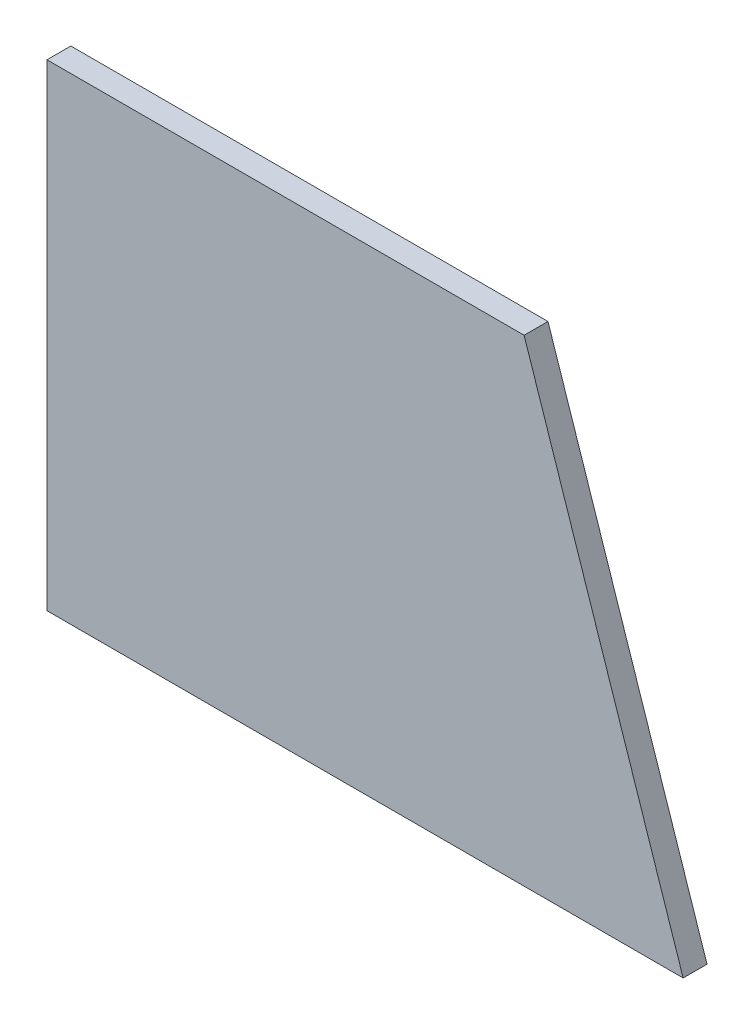
ISO-10303-21;
HEADER;
FILE_DESCRIPTION(('STEP AP214'),'2;1');
FILE_NAME('part.step','',(''),(''),'','','');
FILE_SCHEMA(('AUTOMOTIVE_DESIGN { 1 0 10303 214 1 1 1 1 }'));
ENDSEC;
DATA;
#1=APPLICATION_CONTEXT('core data for automotive mechanical design processes');
#2=APPLICATION_PROTOCOL_DEFINITION('international standard','automotive_design',2000,#1);
#3=PRODUCT_CONTEXT('',#1,'mechanical');
#4=PRODUCT('Part','Part','',(#3));
#5=PRODUCT_RELATED_PRODUCT_CATEGORY('part','',(#4));
#6=PRODUCT_DEFINITION_FORMATION('','',#4);
#7=PRODUCT_DEFINITION_CONTEXT('part definition',#1,'design');
#8=PRODUCT_DEFINITION('design','',#6,#7);
#9=PRODUCT_DEFINITION_SHAPE('','',#8);
#10=(LENGTH_UNIT() NAMED_UNIT(*) SI_UNIT(.MILLI.,.METRE.));
#11=(NAMED_UNIT(*) PLANE_ANGLE_UNIT() SI_UNIT($,.RADIAN.));
#12=(NAMED_UNIT(*) SI_UNIT($,.STERADIAN.) SOLID_ANGLE_UNIT());
#13=UNCERTAINTY_MEASURE_WITH_UNIT(LENGTH_MEASURE(1.E-05),#10,'distance_accuracy_value','');
#14=(GEOMETRIC_REPRESENTATION_CONTEXT(3) GLOBAL_UNCERTAINTY_ASSIGNED_CONTEXT((#13)) GLOBAL_UNIT_ASSIGNED_CONTEXT((#10,
#11,#12)) REPRESENTATION_CONTEXT('',''));
#15=CARTESIAN_POINT('',(0.,0.,0.));
#16=DIRECTION('',(0.,0.,1.));
#17=DIRECTION('',(1.,0.,0.));
#18=AXIS2_PLACEMENT_3D('',#15,#16,#17);
#19=CARTESIAN_POINT('',(0.526438878214051,-0.279919601159078,0.015));
#20=DIRECTION('',(0.,1.,0.));
#21=DIRECTION('',(-1.,0.,0.));
#22=AXIS2_PLACEMENT_3D('',#19,#20,#21);
#23=PLANE('',#22);
#24=DIRECTION('',(1.,0.,0.));
#25=VECTOR('',#24,1.);
#26=CARTESIAN_POINT('',(0.526438878214051,-0.279919601159078,-0.015));
#27=LINE('',#26,#25);
#28=CARTESIAN_POINT('',(-0.273561121785949,-0.279919601159078,-0.015));
#29=VERTEX_POINT('',#28);
#30=CARTESIAN_POINT('',(0.526438878214051,-0.279919601159078,-0.015));
#31=VERTEX_POINT('',#30);
#32=EDGE_CURVE('E95',#29,#31,#27,.T.);
#33=ORIENTED_EDGE('',*,*,#32,.T.);
#34=DIRECTION('',(0.,0.,-1.));
#35=VECTOR('',#34,1.);
#36=CARTESIAN_POINT('',(0.526438878214051,-0.279919601159078,0.015));
#37=LINE('',#36,#35);
#38=CARTESIAN_POINT('',(0.526438878214051,-0.279919601159078,0.015));
#39=VERTEX_POINT('',#38);
#40=EDGE_CURVE('E11',#39,#31,#37,.T.);
#41=ORIENTED_EDGE('',*,*,#40,.F.);
#42=DIRECTION('',(1.,0.,0.));
#43=VECTOR('',#42,1.);
#44=CARTESIAN_POINT('',(0.526438878214051,-0.279919601159078,0.015));
#45=LINE('',#44,#43);
#46=CARTESIAN_POINT('',(-0.273561121785949,-0.279919601159078,0.015));
#47=VERTEX_POINT('',#46);
#48=EDGE_CURVE('E83',#47,#39,#45,.T.);
#49=ORIENTED_EDGE('',*,*,#48,.F.);
#50=DIRECTION('',(0.,0.,-1.));
#51=VECTOR('',#50,1.);
#52=CARTESIAN_POINT('',(-0.273561121785949,-0.279919601159078,0.015));
#53=LINE('',#52,#51);
#54=EDGE_CURVE('E91',#47,#29,#53,.T.);
#55=ORIENTED_EDGE('',*,*,#54,.T.);
#56=EDGE_LOOP('',(#33,#41,#49,#55));
#57=FACE_BOUND('',#56,.T.);
#58=ADVANCED_FACE('F32',(#57),#23,.F.);
#59=CARTESIAN_POINT('',(0.326438878214051,0.320080398840922,0.015));
#60=DIRECTION('',(-0.948683298050514,-0.316227766016838,0.));
#61=DIRECTION('',(0.316227766016838,-0.948683298050514,0.));
#62=AXIS2_PLACEMENT_3D('',#59,#60,#61);
#63=PLANE('',#62);
#64=DIRECTION('',(-0.316227766016838,0.948683298050514,0.));
#65=VECTOR('',#64,1.);
#66=CARTESIAN_POINT('',(0.326438878214051,0.320080398840922,-0.015));
#67=LINE('',#66,#65);
#68=CARTESIAN_POINT('',(0.326438878214051,0.320080398840922,-0.015));
#69=VERTEX_POINT('',#68);
#70=EDGE_CURVE('E87',#31,#69,#67,.T.);
#71=ORIENTED_EDGE('',*,*,#70,.T.);
#72=DIRECTION('',(0.,0.,-1.));
#73=VECTOR('',#72,1.);
#74=CARTESIAN_POINT('',(0.326438878214051,0.320080398840922,0.015));
#75=LINE('',#74,#73);
#76=CARTESIAN_POINT('',(0.326438878214051,0.320080398840922,0.015));
#77=VERTEX_POINT('',#76);
#78=EDGE_CURVE('E40',#77,#69,#75,.T.);
#79=ORIENTED_EDGE('',*,*,#78,.F.);
#80=DIRECTION('',(-0.316227766016838,0.948683298050514,0.));
#81=VECTOR('',#80,1.);
#82=CARTESIAN_POINT('',(0.326438878214051,0.320080398840922,0.015));
#83=LINE('',#82,#81);
#84=EDGE_CURVE('E78',#39,#77,#83,.T.);
#85=ORIENTED_EDGE('',*,*,#84,.F.);
#86=ORIENTED_EDGE('',*,*,#40,.T.);
#87=EDGE_LOOP('',(#71,#79,#85,#86));
#88=FACE_BOUND('',#87,.T.);
#89=ADVANCED_FACE('F86',(#88),#63,.F.);
#90=CARTESIAN_POINT('',(-0.273561121785949,0.320080398840922,0.015));
#91=DIRECTION('',(0.,-1.,0.));
#92=DIRECTION('',(1.,0.,0.));
#93=AXIS2_PLACEMENT_3D('',#90,#91,#92);
#94=PLANE('',#93);
#95=DIRECTION('',(-1.,0.,0.));
#96=VECTOR('',#95,1.);
#97=CARTESIAN_POINT('',(-0.273561121785949,0.320080398840922,-0.015));
#98=LINE('',#97,#96);
#99=CARTESIAN_POINT('',(-0.273561121785949,0.320080398840922,-0.015));
#100=VERTEX_POINT('',#99);
#101=EDGE_CURVE('E65',#69,#100,#98,.T.);
#102=ORIENTED_EDGE('',*,*,#101,.T.);
#103=DIRECTION('',(0.,0.,-1.));
#104=VECTOR('',#103,1.);
#105=CARTESIAN_POINT('',(-0.273561121785949,0.320080398840922,0.015));
#106=LINE('',#105,#104);
#107=CARTESIAN_POINT('',(-0.273561121785949,0.320080398840922,0.015));
#108=VERTEX_POINT('',#107);
#109=EDGE_CURVE('E88',#108,#100,#106,.T.);
#110=ORIENTED_EDGE('',*,*,#109,.F.);
#111=DIRECTION('',(-1.,0.,0.));
#112=VECTOR('',#111,1.);
#113=CARTESIAN_POINT('',(-0.273561121785949,0.320080398840922,0.015));
#114=LINE('',#113,#112);
#115=EDGE_CURVE('E81',#77,#108,#114,.T.);
#116=ORIENTED_EDGE('',*,*,#115,.F.);
#117=ORIENTED_EDGE('',*,*,#78,.T.);
#118=EDGE_LOOP('',(#102,#110,#116,#117));
#119=FACE_BOUND('',#118,.T.);
#120=ADVANCED_FACE('F89',(#119),#94,.F.);
#121=CARTESIAN_POINT('',(-0.273561121785949,-0.279919601159078,0.015));
#122=DIRECTION('',(1.,0.,0.));
#123=DIRECTION('',(0.,1.,0.));
#124=AXIS2_PLACEMENT_3D('',#121,#122,#123);
#125=PLANE('',#124);
#126=DIRECTION('',(0.,-1.,0.));
#127=VECTOR('',#126,1.);
#128=CARTESIAN_POINT('',(-0.273561121785949,-0.279919601159078,-0.015));
#129=LINE('',#128,#127);
#130=EDGE_CURVE('E71',#100,#29,#129,.T.);
#131=ORIENTED_EDGE('',*,*,#130,.T.);
#132=ORIENTED_EDGE('',*,*,#54,.F.);
#133=DIRECTION('',(0.,-1.,0.));
#134=VECTOR('',#133,1.);
#135=CARTESIAN_POINT('',(-0.273561121785949,-0.279919601159078,0.015));
#136=LINE('',#135,#134);
#137=EDGE_CURVE('E48',#108,#47,#136,.T.);
#138=ORIENTED_EDGE('',*,*,#137,.F.);
#139=ORIENTED_EDGE('',*,*,#109,.T.);
#140=EDGE_LOOP('',(#131,#132,#138,#139));
#141=FACE_BOUND('',#140,.T.);
#142=ADVANCED_FACE('F102',(#141),#125,.F.);
#143=CARTESIAN_POINT('',(0.,0.,0.015));
#144=DIRECTION('',(0.,0.,-1.));
#145=DIRECTION('',(-1.,0.,0.));
#146=AXIS2_PLACEMENT_3D('',#143,#144,#145);
#147=PLANE('',#146);
#148=ORIENTED_EDGE('',*,*,#48,.T.);
#149=ORIENTED_EDGE('',*,*,#84,.T.);
#150=ORIENTED_EDGE('',*,*,#115,.T.);
#151=ORIENTED_EDGE('',*,*,#137,.T.);
#152=EDGE_LOOP('',(#148,#149,#150,#151));
#153=FACE_BOUND('',#152,.T.);
#154=ADVANCED_FACE('F79',(#153),#147,.F.);
#155=CARTESIAN_POINT('',(0.,0.,-0.015));
#156=DIRECTION('',(0.,0.,-1.));
#157=DIRECTION('',(-1.,0.,0.));
#158=AXIS2_PLACEMENT_3D('',#155,#156,#157);
#159=PLANE('',#158);
#160=ORIENTED_EDGE('',*,*,#32,.F.);
#161=ORIENTED_EDGE('',*,*,#130,.F.);
#162=ORIENTED_EDGE('',*,*,#101,.F.);
#163=ORIENTED_EDGE('',*,*,#70,.F.);
#164=EDGE_LOOP('',(#160,#161,#162,#163));
#165=FACE_BOUND('',#164,.T.);
#166=ADVANCED_FACE('F105',(#165),#159,.T.);
#167=CLOSED_SHELL('',(#58,#89,#120,#142,#154,#166));
#168=MANIFOLD_SOLID_BREP('B2',#167);
#169=ADVANCED_BREP_SHAPE_REPRESENTATION('',(#18,#168),#14);
#170=SHAPE_DEFINITION_REPRESENTATION(#9,#169);
ENDSEC;
END-ISO-10303-21;
